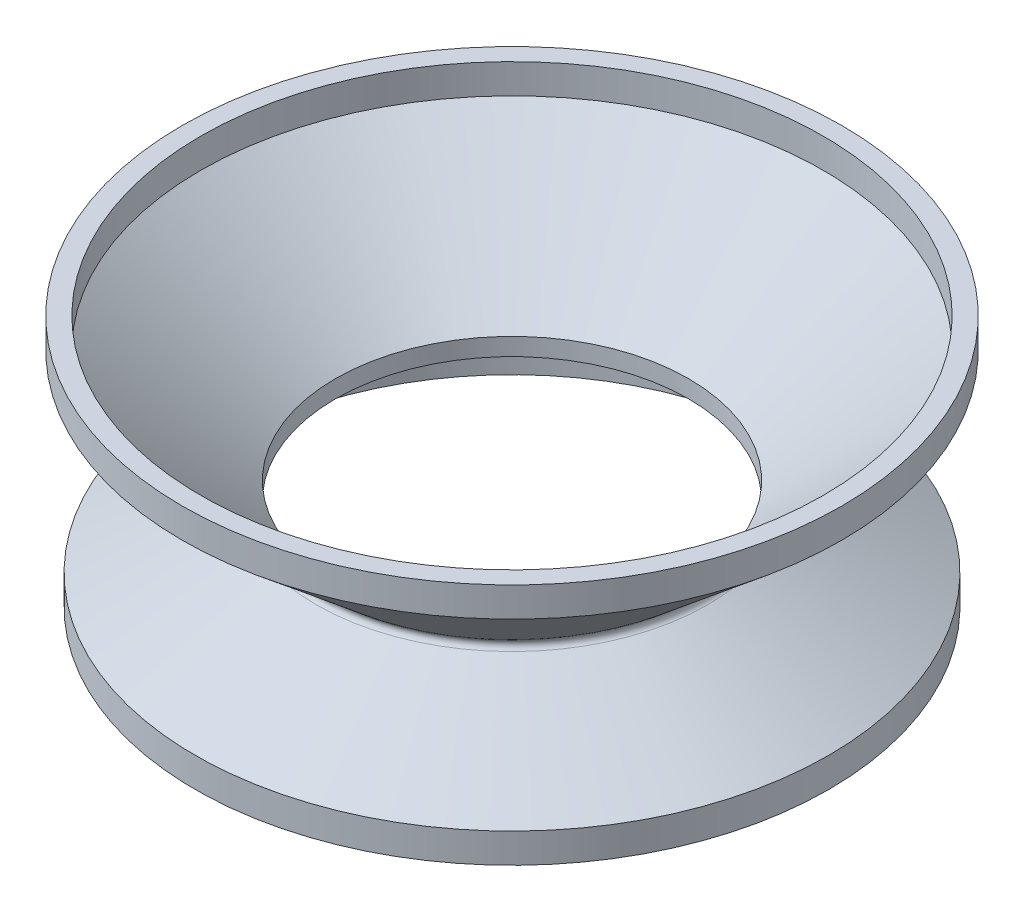
ISO-10303-21;
HEADER;
FILE_DESCRIPTION(('STEP AP214'),'2;1');
FILE_NAME('part.step','',(''),(''),'','','');
FILE_SCHEMA(('AUTOMOTIVE_DESIGN { 1 0 10303 214 1 1 1 1 }'));
ENDSEC;
DATA;
#1=APPLICATION_CONTEXT('core data for automotive mechanical design processes');
#2=APPLICATION_PROTOCOL_DEFINITION('international standard','automotive_design',2000,#1);
#3=PRODUCT_CONTEXT('',#1,'mechanical');
#4=PRODUCT('Part','Part','',(#3));
#5=PRODUCT_RELATED_PRODUCT_CATEGORY('part','',(#4));
#6=PRODUCT_DEFINITION_FORMATION('','',#4);
#7=PRODUCT_DEFINITION_CONTEXT('part definition',#1,'design');
#8=PRODUCT_DEFINITION('design','',#6,#7);
#9=PRODUCT_DEFINITION_SHAPE('','',#8);
#10=(LENGTH_UNIT() NAMED_UNIT(*) SI_UNIT(.MILLI.,.METRE.));
#11=(NAMED_UNIT(*) PLANE_ANGLE_UNIT() SI_UNIT($,.RADIAN.));
#12=(NAMED_UNIT(*) SI_UNIT($,.STERADIAN.) SOLID_ANGLE_UNIT());
#13=UNCERTAINTY_MEASURE_WITH_UNIT(LENGTH_MEASURE(1.E-05),#10,'distance_accuracy_value','');
#14=(GEOMETRIC_REPRESENTATION_CONTEXT(3) GLOBAL_UNCERTAINTY_ASSIGNED_CONTEXT((#13)) GLOBAL_UNIT_ASSIGNED_CONTEXT((#10,
#11,#12)) REPRESENTATION_CONTEXT('',''));
#15=CARTESIAN_POINT('',(0.,0.,0.));
#16=DIRECTION('',(0.,0.,1.));
#17=DIRECTION('',(1.,0.,0.));
#18=AXIS2_PLACEMENT_3D('',#15,#16,#17);
#19=CARTESIAN_POINT('',(13.3733322733685,0.,0.));
#20=DIRECTION('',(0.,-1.,0.));
#21=DIRECTION('',(1.,0.,0.));
#22=AXIS2_PLACEMENT_3D('',#19,#20,#21);
#23=CONICAL_SURFACE('',#22,12.7105503207345,1.0471975511966);
#24=CARTESIAN_POINT('',(13.3733322733685,-0.285629601348422,0.));
#25=DIRECTION('',(0.,-1.,0.));
#26=DIRECTION('',(1.,0.,0.));
#27=AXIS2_PLACEMENT_3D('',#24,#25,#26);
#28=CIRCLE('',#27,13.2052753024157);
#29=CARTESIAN_POINT('',(26.5786075757842,-0.28562960134842,0.));
#30=VERTEX_POINT('',#29);
#31=EDGE_CURVE('E10',#30,#30,#28,.T.);
#32=ORIENTED_EDGE('',*,*,#31,.T.);
#33=EDGE_LOOP('',(#32));
#34=FACE_BOUND('',#33,.T.);
#35=CARTESIAN_POINT('',(13.3733322733685,-5.,0.));
#36=DIRECTION('',(0.,-1.,0.));
#37=DIRECTION('',(1.,0.,0.));
#38=AXIS2_PLACEMENT_3D('',#35,#36,#37);
#39=CIRCLE('',#38,21.3708043585791);
#40=CARTESIAN_POINT('',(34.7441366319476,-4.99999999999999,0.));
#41=VERTEX_POINT('',#40);
#42=EDGE_CURVE('E88',#41,#41,#39,.T.);
#43=ORIENTED_EDGE('',*,*,#42,.F.);
#44=EDGE_LOOP('',(#43));
#45=FACE_BOUND('',#44,.T.);
#46=ADVANCED_FACE('F43',(#34,#45),#23,.T.);
#47=CARTESIAN_POINT('',(13.3733322733685,8.,0.));
#48=DIRECTION('',(0.,1.,0.));
#49=DIRECTION('',(-1.,0.,0.));
#50=AXIS2_PLACEMENT_3D('',#47,#48,#49);
#51=CONICAL_SURFACE('',#50,22.2445790614883,0.87266462599717);
#52=CARTESIAN_POINT('',(13.3733322733685,0.367198337412947,0.));
#53=DIRECTION('',(0.,1.,0.));
#54=DIRECTION('',(-1.,0.,0.));
#55=AXIS2_PLACEMENT_3D('',#52,#53,#54);
#56=CIRCLE('',#55,13.1481602585411);
#57=CARTESIAN_POINT('',(0.225172014827461,0.367198337412946,0.));
#58=VERTEX_POINT('',#57);
#59=EDGE_CURVE('E51',#58,#58,#56,.T.);
#60=ORIENTED_EDGE('',*,*,#59,.T.);
#61=EDGE_LOOP('',(#60));
#62=FACE_BOUND('',#61,.T.);
#63=CARTESIAN_POINT('',(13.3733322733685,8.,0.));
#64=DIRECTION('',(0.,1.,0.));
#65=DIRECTION('',(-1.,0.,0.));
#66=AXIS2_PLACEMENT_3D('',#63,#64,#65);
#67=CIRCLE('',#66,22.2445790614883);
#68=CARTESIAN_POINT('',(-8.87124678811982,8.,0.));
#69=VERTEX_POINT('',#68);
#70=EDGE_CURVE('E56',#69,#69,#67,.T.);
#71=ORIENTED_EDGE('',*,*,#70,.F.);
#72=EDGE_LOOP('',(#71));
#73=FACE_BOUND('',#72,.T.);
#74=ADVANCED_FACE('F120',(#62,#73),#51,.T.);
#75=CARTESIAN_POINT('',(13.3733322733685,0.373046126524004,0.));
#76=DIRECTION('',(0.,1.,0.));
#77=DIRECTION('',(-1.,0.,0.));
#78=AXIS2_PLACEMENT_3D('',#75,#76,#77);
#79=CONICAL_SURFACE('',#78,11.9105503207345,0.872664625997171);
#80=CARTESIAN_POINT('',(13.3733322733685,8.,0.));
#81=DIRECTION('',(0.,1.,0.));
#82=DIRECTION('',(-1.,0.,0.));
#83=AXIS2_PLACEMENT_3D('',#80,#81,#82);
#84=CIRCLE('',#83,21.);
#85=CARTESIAN_POINT('',(-7.62666772663149,8.,0.));
#86=VERTEX_POINT('',#85);
#87=EDGE_CURVE('E80',#86,#86,#84,.T.);
#88=ORIENTED_EDGE('',*,*,#87,.T.);
#89=EDGE_LOOP('',(#88));
#90=FACE_BOUND('',#89,.T.);
#91=CARTESIAN_POINT('',(13.3733322733685,0.373046126524004,0.));
#92=DIRECTION('',(0.,1.,0.));
#93=DIRECTION('',(-1.,0.,0.));
#94=AXIS2_PLACEMENT_3D('',#91,#92,#93);
#95=CIRCLE('',#94,11.9105503207345);
#96=CARTESIAN_POINT('',(1.46278195263397,0.373046126524003,0.));
#97=VERTEX_POINT('',#96);
#98=EDGE_CURVE('E61',#97,#97,#95,.T.);
#99=ORIENTED_EDGE('',*,*,#98,.F.);
#100=EDGE_LOOP('',(#99));
#101=FACE_BOUND('',#100,.T.);
#102=ADVANCED_FACE('F125',(#90,#101),#79,.F.);
#103=CARTESIAN_POINT('',(13.3733322733685,7.60901803281972,0.));
#104=DIRECTION('',(0.,1.,0.));
#105=DIRECTION('',(-1.,0.,0.));
#106=AXIS2_PLACEMENT_3D('',#103,#104,#105);
#107=CYLINDRICAL_SURFACE('',#106,11.9105503207345);
#108=ORIENTED_EDGE('',*,*,#98,.T.);
#109=EDGE_LOOP('',(#108));
#110=FACE_BOUND('',#109,.T.);
#111=CARTESIAN_POINT('',(13.3733322733685,-0.808290376865477,0.));
#112=DIRECTION('',(0.,1.,0.));
#113=DIRECTION('',(-1.,0.,0.));
#114=AXIS2_PLACEMENT_3D('',#111,#112,#113);
#115=CIRCLE('',#114,11.9105503207345);
#116=CARTESIAN_POINT('',(1.46278195263397,-0.808290376865478,0.));
#117=VERTEX_POINT('',#116);
#118=EDGE_CURVE('E67',#117,#117,#115,.T.);
#119=ORIENTED_EDGE('',*,*,#118,.F.);
#120=EDGE_LOOP('',(#119));
#121=FACE_BOUND('',#120,.T.);
#122=ADVANCED_FACE('F131',(#110,#121),#107,.F.);
#123=CARTESIAN_POINT('',(13.3733322733685,-5.,0.));
#124=DIRECTION('',(0.,-1.,0.));
#125=DIRECTION('',(1.,0.,0.));
#126=AXIS2_PLACEMENT_3D('',#123,#124,#125);
#127=CONICAL_SURFACE('',#126,19.170804358579,1.0471975511966);
#128=ORIENTED_EDGE('',*,*,#118,.T.);
#129=EDGE_LOOP('',(#128));
#130=FACE_BOUND('',#129,.T.);
#131=CARTESIAN_POINT('',(13.3733322733685,-5.,0.));
#132=DIRECTION('',(0.,1.,0.));
#133=DIRECTION('',(-1.,0.,0.));
#134=AXIS2_PLACEMENT_3D('',#131,#132,#133);
#135=CIRCLE('',#134,19.170804358579);
#136=CARTESIAN_POINT('',(-5.79747208521052,-5.,0.));
#137=VERTEX_POINT('',#136);
#138=EDGE_CURVE('E71',#137,#137,#135,.T.);
#139=ORIENTED_EDGE('',*,*,#138,.F.);
#140=EDGE_LOOP('',(#139));
#141=FACE_BOUND('',#140,.T.);
#142=ADVANCED_FACE('F135',(#130,#141),#127,.F.);
#143=CARTESIAN_POINT('',(13.3733322733685,0.0607805601653549,0.));
#144=DIRECTION('',(0.,1.,0.));
#145=DIRECTION('',(-1.,0.,0.));
#146=AXIS2_PLACEMENT_3D('',#143,#144,#145);
#147=TOROIDAL_SURFACE('',#146,13.4052753024157,0.4);
#148=ORIENTED_EDGE('',*,*,#31,.F.);
#149=EDGE_LOOP('',(#148));
#150=FACE_BOUND('',#149,.T.);
#151=ORIENTED_EDGE('',*,*,#59,.F.);
#152=EDGE_LOOP('',(#151));
#153=FACE_BOUND('',#152,.T.);
#154=ADVANCED_FACE('F45',(#150,#153),#147,.F.);
#155=CARTESIAN_POINT('',(13.3733322733685,10.,0.));
#156=DIRECTION('',(0.,1.,0.));
#157=DIRECTION('',(-1.,0.,0.));
#158=AXIS2_PLACEMENT_3D('',#155,#156,#157);
#159=PLANE('',#158);
#160=CARTESIAN_POINT('',(13.3733322733685,10.,0.));
#161=DIRECTION('',(0.,1.,0.));
#162=DIRECTION('',(-1.,0.,0.));
#163=AXIS2_PLACEMENT_3D('',#160,#161,#162);
#164=CIRCLE('',#163,22.2445790614883);
#165=CARTESIAN_POINT('',(-8.87124678811982,10.,0.));
#166=VERTEX_POINT('',#165);
#167=EDGE_CURVE('E75',#166,#166,#164,.T.);
#168=ORIENTED_EDGE('',*,*,#167,.T.);
#169=EDGE_LOOP('',(#168));
#170=FACE_BOUND('',#169,.T.);
#171=CARTESIAN_POINT('',(13.3733322733685,10.,0.));
#172=DIRECTION('',(0.,1.,0.));
#173=DIRECTION('',(-1.,0.,0.));
#174=AXIS2_PLACEMENT_3D('',#171,#172,#173);
#175=CIRCLE('',#174,21.);
#176=CARTESIAN_POINT('',(-7.62666772663149,10.,0.));
#177=VERTEX_POINT('',#176);
#178=EDGE_CURVE('E79',#177,#177,#175,.T.);
#179=ORIENTED_EDGE('',*,*,#178,.F.);
#180=EDGE_LOOP('',(#179));
#181=FACE_BOUND('',#180,.T.);
#182=ADVANCED_FACE('F141',(#170,#181),#159,.T.);
#183=CARTESIAN_POINT('',(13.3733322733685,10.,0.));
#184=DIRECTION('',(0.,-1.,0.));
#185=DIRECTION('',(1.,0.,0.));
#186=AXIS2_PLACEMENT_3D('',#183,#184,#185);
#187=CYLINDRICAL_SURFACE('',#186,22.2445790614883);
#188=ORIENTED_EDGE('',*,*,#167,.F.);
#189=EDGE_LOOP('',(#188));
#190=FACE_BOUND('',#189,.T.);
#191=ORIENTED_EDGE('',*,*,#70,.T.);
#192=EDGE_LOOP('',(#191));
#193=FACE_BOUND('',#192,.T.);
#194=ADVANCED_FACE('F115',(#190,#193),#187,.T.);
#195=CARTESIAN_POINT('',(13.3733322733685,10.,0.));
#196=DIRECTION('',(0.,-1.,0.));
#197=DIRECTION('',(1.,0.,0.));
#198=AXIS2_PLACEMENT_3D('',#195,#196,#197);
#199=CYLINDRICAL_SURFACE('',#198,21.);
#200=ORIENTED_EDGE('',*,*,#178,.T.);
#201=EDGE_LOOP('',(#200));
#202=FACE_BOUND('',#201,.T.);
#203=ORIENTED_EDGE('',*,*,#87,.F.);
#204=EDGE_LOOP('',(#203));
#205=FACE_BOUND('',#204,.T.);
#206=ADVANCED_FACE('F106',(#202,#205),#199,.F.);
#207=CARTESIAN_POINT('',(13.3733322733685,-6.99999999999999,0.));
#208=DIRECTION('',(0.,-1.,0.));
#209=DIRECTION('',(1.,0.,0.));
#210=AXIS2_PLACEMENT_3D('',#207,#208,#209);
#211=PLANE('',#210);
#212=CARTESIAN_POINT('',(13.3733322733685,-6.99999999999999,0.));
#213=DIRECTION('',(0.,-1.,0.));
#214=DIRECTION('',(1.,0.,0.));
#215=AXIS2_PLACEMENT_3D('',#212,#213,#214);
#216=CIRCLE('',#215,21.3708043585791);
#217=CARTESIAN_POINT('',(34.7441366319476,-6.99999999999999,0.));
#218=VERTEX_POINT('',#217);
#219=EDGE_CURVE('E84',#218,#218,#216,.T.);
#220=ORIENTED_EDGE('',*,*,#219,.T.);
#221=EDGE_LOOP('',(#220));
#222=FACE_BOUND('',#221,.T.);
#223=CARTESIAN_POINT('',(13.3733322733685,-6.99999999999999,0.));
#224=DIRECTION('',(0.,-1.,0.));
#225=DIRECTION('',(1.,0.,0.));
#226=AXIS2_PLACEMENT_3D('',#223,#224,#225);
#227=CIRCLE('',#226,19.170804358579);
#228=CARTESIAN_POINT('',(32.5441366319476,-6.99999999999999,0.));
#229=VERTEX_POINT('',#228);
#230=EDGE_CURVE('E92',#229,#229,#227,.T.);
#231=ORIENTED_EDGE('',*,*,#230,.F.);
#232=EDGE_LOOP('',(#231));
#233=FACE_BOUND('',#232,.T.);
#234=ADVANCED_FACE('F103',(#222,#233),#211,.T.);
#235=CARTESIAN_POINT('',(13.3733322733685,-6.99999999999999,0.));
#236=DIRECTION('',(0.,1.,0.));
#237=DIRECTION('',(-1.,0.,0.));
#238=AXIS2_PLACEMENT_3D('',#235,#236,#237);
#239=CYLINDRICAL_SURFACE('',#238,21.3708043585791);
#240=ORIENTED_EDGE('',*,*,#219,.F.);
#241=EDGE_LOOP('',(#240));
#242=FACE_BOUND('',#241,.T.);
#243=ORIENTED_EDGE('',*,*,#42,.T.);
#244=EDGE_LOOP('',(#243));
#245=FACE_BOUND('',#244,.T.);
#246=ADVANCED_FACE('F105',(#242,#245),#239,.T.);
#247=CARTESIAN_POINT('',(13.3733322733685,-6.99999999999999,0.));
#248=DIRECTION('',(0.,1.,0.));
#249=DIRECTION('',(-1.,0.,0.));
#250=AXIS2_PLACEMENT_3D('',#247,#248,#249);
#251=CYLINDRICAL_SURFACE('',#250,19.170804358579);
#252=ORIENTED_EDGE('',*,*,#230,.T.);
#253=EDGE_LOOP('',(#252));
#254=FACE_BOUND('',#253,.T.);
#255=ORIENTED_EDGE('',*,*,#138,.T.);
#256=EDGE_LOOP('',(#255));
#257=FACE_BOUND('',#256,.T.);
#258=ADVANCED_FACE('F100',(#254,#257),#251,.F.);
#259=CLOSED_SHELL('',(#46,#74,#102,#122,#142,#154,#182,#194,#206,#234,#246,#258));
#260=MANIFOLD_SOLID_BREP('B2',#259);
#261=ADVANCED_BREP_SHAPE_REPRESENTATION('',(#18,#260),#14);
#262=SHAPE_DEFINITION_REPRESENTATION(#9,#261);
ENDSEC;
END-ISO-10303-21;
